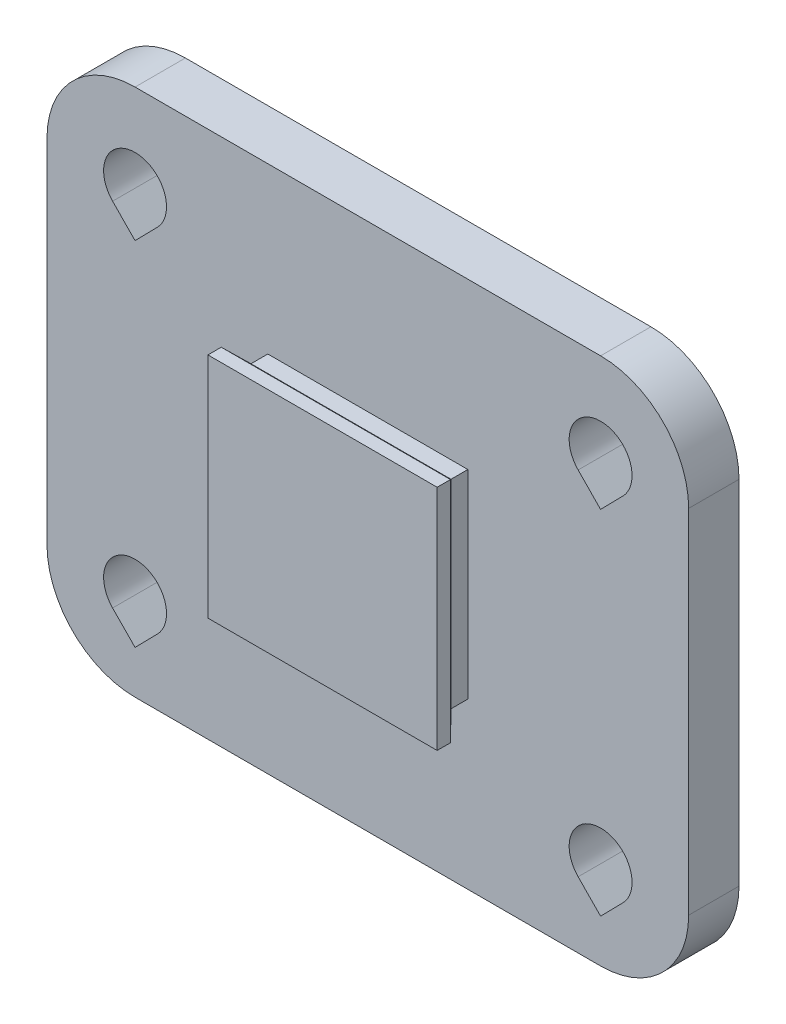
ISO-10303-21;
HEADER;
FILE_DESCRIPTION(('STEP AP214'),'2;1');
FILE_NAME('part.step','',(''),(''),'','','');
FILE_SCHEMA(('AUTOMOTIVE_DESIGN { 1 0 10303 214 1 1 1 1 }'));
ENDSEC;
DATA;
#1=APPLICATION_CONTEXT('core data for automotive mechanical design processes');
#2=APPLICATION_PROTOCOL_DEFINITION('international standard','automotive_design',2000,#1);
#3=PRODUCT_CONTEXT('',#1,'mechanical');
#4=PRODUCT('Part','Part','',(#3));
#5=PRODUCT_RELATED_PRODUCT_CATEGORY('part','',(#4));
#6=PRODUCT_DEFINITION_FORMATION('','',#4);
#7=PRODUCT_DEFINITION_CONTEXT('part definition',#1,'design');
#8=PRODUCT_DEFINITION('design','',#6,#7);
#9=PRODUCT_DEFINITION_SHAPE('','',#8);
#10=(LENGTH_UNIT() NAMED_UNIT(*) SI_UNIT(.MILLI.,.METRE.));
#11=(NAMED_UNIT(*) PLANE_ANGLE_UNIT() SI_UNIT($,.RADIAN.));
#12=(NAMED_UNIT(*) SI_UNIT($,.STERADIAN.) SOLID_ANGLE_UNIT());
#13=UNCERTAINTY_MEASURE_WITH_UNIT(LENGTH_MEASURE(1.E-05),#10,'distance_accuracy_value','');
#14=(GEOMETRIC_REPRESENTATION_CONTEXT(3) GLOBAL_UNCERTAINTY_ASSIGNED_CONTEXT((#13)) GLOBAL_UNIT_ASSIGNED_CONTEXT((#10,
#11,#12)) REPRESENTATION_CONTEXT('',''));
#15=CARTESIAN_POINT('',(0.,0.,0.));
#16=DIRECTION('',(0.,0.,1.));
#17=DIRECTION('',(1.,0.,0.));
#18=AXIS2_PLACEMENT_3D('',#15,#16,#17);
#19=CARTESIAN_POINT('',(18.5,10.426852951642,8.011074047634));
#20=DIRECTION('',(0.714472679633082,-0.699663340513081,0.));
#21=DIRECTION('',(0.,0.,-1.));
#22=AXIS2_PLACEMENT_3D('',#19,#20,#21);
#23=PLANE('',#22);
#24=DIRECTION('',(0.,0.,-1.));
#25=VECTOR('',#24,1.);
#26=CARTESIAN_POINT('',(18.5,10.426852951642,4.));
#27=LINE('',#26,#25);
#28=CARTESIAN_POINT('',(18.5,10.426852951642,4.));
#29=VERTEX_POINT('',#28);
#30=CARTESIAN_POINT('',(18.5,10.426852951642,0.));
#31=VERTEX_POINT('',#30);
#32=EDGE_CURVE('E11',#29,#31,#27,.T.);
#33=ORIENTED_EDGE('',*,*,#32,.F.);
#34=DIRECTION('',(0.699663340513081,0.714472679633082,0.));
#35=VECTOR('',#34,1.);
#36=CARTESIAN_POINT('',(18.5,10.426852951642,4.));
#37=LINE('',#36,#35);
#38=CARTESIAN_POINT('',(20.286181699082,12.250841648717,4.));
#39=VERTEX_POINT('',#38);
#40=EDGE_CURVE('E476',#29,#39,#37,.T.);
#41=ORIENTED_EDGE('',*,*,#40,.T.);
#42=DIRECTION('',(0.,0.,-1.));
#43=VECTOR('',#42,1.);
#44=CARTESIAN_POINT('',(20.286181699082,12.250841648717,4.));
#45=LINE('',#44,#43);
#46=CARTESIAN_POINT('',(20.286181699082,12.250841648717,0.));
#47=VERTEX_POINT('',#46);
#48=EDGE_CURVE('E341',#39,#47,#45,.T.);
#49=ORIENTED_EDGE('',*,*,#48,.T.);
#50=DIRECTION('',(0.699663340513081,0.714472679633082,0.));
#51=VECTOR('',#50,1.);
#52=CARTESIAN_POINT('',(18.5,10.426852951642,0.));
#53=LINE('',#52,#51);
#54=EDGE_CURVE('E312',#31,#47,#53,.T.);
#55=ORIENTED_EDGE('',*,*,#54,.F.);
#56=EDGE_LOOP('',(#33,#41,#49,#55));
#57=FACE_BOUND('',#56,.T.);
#58=ADVANCED_FACE('F17',(#57),#23,.F.);
#59=CARTESIAN_POINT('',(16.713818300918,12.250841648717,8.011074047634));
#60=DIRECTION('',(-0.714472679633082,-0.699663340513081,0.));
#61=DIRECTION('',(-0.699663340513081,0.714472679633082,0.));
#62=AXIS2_PLACEMENT_3D('',#59,#60,#61);
#63=PLANE('',#62);
#64=DIRECTION('',(0.,0.,-1.));
#65=VECTOR('',#64,1.);
#66=CARTESIAN_POINT('',(16.713818300918,12.250841648717,4.));
#67=LINE('',#66,#65);
#68=CARTESIAN_POINT('',(16.713818300918,12.250841648717,4.));
#69=VERTEX_POINT('',#68);
#70=CARTESIAN_POINT('',(16.713818300918,12.250841648717,0.));
#71=VERTEX_POINT('',#70);
#72=EDGE_CURVE('E338',#69,#71,#67,.T.);
#73=ORIENTED_EDGE('',*,*,#72,.F.);
#74=DIRECTION('',(0.699663340513081,-0.714472679633082,0.));
#75=VECTOR('',#74,1.);
#76=CARTESIAN_POINT('',(16.713818300918,12.250841648717,4.));
#77=LINE('',#76,#75);
#78=EDGE_CURVE('E484',#69,#29,#77,.T.);
#79=ORIENTED_EDGE('',*,*,#78,.T.);
#80=ORIENTED_EDGE('',*,*,#32,.T.);
#81=DIRECTION('',(0.699663340513081,-0.714472679633082,0.));
#82=VECTOR('',#81,1.);
#83=CARTESIAN_POINT('',(16.713818300918,12.250841648717,0.));
#84=LINE('',#83,#82);
#85=EDGE_CURVE('E333',#71,#31,#84,.T.);
#86=ORIENTED_EDGE('',*,*,#85,.F.);
#87=EDGE_LOOP('',(#73,#79,#80,#86));
#88=FACE_BOUND('',#87,.T.);
#89=ADVANCED_FACE('F457',(#88),#63,.F.);
#90=CARTESIAN_POINT('',(18.5,-17.57314704835,8.011074047634));
#91=DIRECTION('',(0.714472679633082,-0.699663340513081,0.));
#92=DIRECTION('',(0.,0.,-1.));
#93=AXIS2_PLACEMENT_3D('',#90,#91,#92);
#94=PLANE('',#93);
#95=DIRECTION('',(0.,0.,-1.));
#96=VECTOR('',#95,1.);
#97=CARTESIAN_POINT('',(18.5,-17.57314704835,4.));
#98=LINE('',#97,#96);
#99=CARTESIAN_POINT('',(18.5,-17.57314704835,4.));
#100=VERTEX_POINT('',#99);
#101=CARTESIAN_POINT('',(18.5,-17.57314704835,0.));
#102=VERTEX_POINT('',#101);
#103=EDGE_CURVE('E20',#100,#102,#98,.T.);
#104=ORIENTED_EDGE('',*,*,#103,.F.);
#105=DIRECTION('',(0.699663340513081,0.714472679633082,0.));
#106=VECTOR('',#105,1.);
#107=CARTESIAN_POINT('',(18.5,-17.57314704835,4.));
#108=LINE('',#107,#106);
#109=CARTESIAN_POINT('',(20.286181699082,-15.74915835128,4.));
#110=VERTEX_POINT('',#109);
#111=EDGE_CURVE('E491',#100,#110,#108,.T.);
#112=ORIENTED_EDGE('',*,*,#111,.T.);
#113=DIRECTION('',(0.,0.,-1.));
#114=VECTOR('',#113,1.);
#115=CARTESIAN_POINT('',(20.286181699082,-15.74915835128,4.));
#116=LINE('',#115,#114);
#117=CARTESIAN_POINT('',(20.286181699082,-15.74915835128,0.));
#118=VERTEX_POINT('',#117);
#119=EDGE_CURVE('E400',#110,#118,#116,.T.);
#120=ORIENTED_EDGE('',*,*,#119,.T.);
#121=DIRECTION('',(0.699663340513081,0.714472679633082,0.));
#122=VECTOR('',#121,1.);
#123=CARTESIAN_POINT('',(18.5,-17.57314704835,0.));
#124=LINE('',#123,#122);
#125=EDGE_CURVE('E337',#102,#118,#124,.T.);
#126=ORIENTED_EDGE('',*,*,#125,.F.);
#127=EDGE_LOOP('',(#104,#112,#120,#126));
#128=FACE_BOUND('',#127,.T.);
#129=ADVANCED_FACE('F455',(#128),#94,.F.);
#130=CARTESIAN_POINT('',(16.713818300918,-15.74915835128,8.011074047634));
#131=DIRECTION('',(-0.714472679633082,-0.699663340513081,0.));
#132=DIRECTION('',(-0.699663340513081,0.714472679633082,0.));
#133=AXIS2_PLACEMENT_3D('',#130,#131,#132);
#134=PLANE('',#133);
#135=DIRECTION('',(0.,0.,-1.));
#136=VECTOR('',#135,1.);
#137=CARTESIAN_POINT('',(16.713818300918,-15.74915835128,4.));
#138=LINE('',#137,#136);
#139=CARTESIAN_POINT('',(16.713818300918,-15.74915835128,4.));
#140=VERTEX_POINT('',#139);
#141=CARTESIAN_POINT('',(16.713818300918,-15.74915835128,0.));
#142=VERTEX_POINT('',#141);
#143=EDGE_CURVE('E397',#140,#142,#138,.T.);
#144=ORIENTED_EDGE('',*,*,#143,.F.);
#145=DIRECTION('',(0.699663340513081,-0.714472679633082,0.));
#146=VECTOR('',#145,1.);
#147=CARTESIAN_POINT('',(16.713818300918,-15.74915835128,4.));
#148=LINE('',#147,#146);
#149=EDGE_CURVE('E451',#140,#100,#148,.T.);
#150=ORIENTED_EDGE('',*,*,#149,.T.);
#151=ORIENTED_EDGE('',*,*,#103,.T.);
#152=DIRECTION('',(0.699663340513081,-0.714472679633082,0.));
#153=VECTOR('',#152,1.);
#154=CARTESIAN_POINT('',(16.713818300918,-15.74915835128,0.));
#155=LINE('',#154,#153);
#156=EDGE_CURVE('E353',#142,#102,#155,.T.);
#157=ORIENTED_EDGE('',*,*,#156,.F.);
#158=EDGE_LOOP('',(#144,#150,#151,#157));
#159=FACE_BOUND('',#158,.T.);
#160=ADVANCED_FACE('F449',(#159),#134,.F.);
#161=CARTESIAN_POINT('',(18.5,-14.,4.));
#162=DIRECTION('',(0.,0.,-1.));
#163=DIRECTION('',(0.,1.,0.));
#164=AXIS2_PLACEMENT_3D('',#161,#162,#163);
#165=CYLINDRICAL_SURFACE('',#164,2.5);
#166=ORIENTED_EDGE('',*,*,#143,.T.);
#167=CARTESIAN_POINT('',(18.5,-14.,0.));
#168=DIRECTION('',(0.,0.,1.));
#169=DIRECTION('',(-1.,0.,0.));
#170=AXIS2_PLACEMENT_3D('',#167,#168,#169);
#171=CIRCLE('',#170,2.5);
#172=EDGE_CURVE('E349',#118,#142,#171,.T.);
#173=ORIENTED_EDGE('',*,*,#172,.F.);
#174=ORIENTED_EDGE('',*,*,#119,.F.);
#175=CARTESIAN_POINT('',(18.5,-14.,4.));
#176=DIRECTION('',(0.,0.,1.));
#177=DIRECTION('',(-1.,0.,0.));
#178=AXIS2_PLACEMENT_3D('',#175,#176,#177);
#179=CIRCLE('',#178,2.5);
#180=EDGE_CURVE('E498',#110,#140,#179,.T.);
#181=ORIENTED_EDGE('',*,*,#180,.T.);
#182=EDGE_LOOP('',(#166,#173,#174,#181));
#183=FACE_BOUND('',#182,.T.);
#184=ADVANCED_FACE('F465',(#183),#165,.F.);
#185=CARTESIAN_POINT('',(18.5,-14.,4.));
#186=DIRECTION('',(0.,0.,-1.));
#187=DIRECTION('',(1.,0.,0.));
#188=AXIS2_PLACEMENT_3D('',#185,#186,#187);
#189=CYLINDRICAL_SURFACE('',#188,7.);
#190=CARTESIAN_POINT('',(18.5,-14.,0.));
#191=DIRECTION('',(0.,0.,1.));
#192=DIRECTION('',(-1.,0.,0.));
#193=AXIS2_PLACEMENT_3D('',#190,#191,#192);
#194=CIRCLE('',#193,7.);
#195=CARTESIAN_POINT('',(18.5,-21.,0.));
#196=VERTEX_POINT('',#195);
#197=CARTESIAN_POINT('',(25.5,-14.,0.));
#198=VERTEX_POINT('',#197);
#199=EDGE_CURVE('E520',#196,#198,#194,.T.);
#200=ORIENTED_EDGE('',*,*,#199,.T.);
#201=DIRECTION('',(0.,0.,-1.));
#202=VECTOR('',#201,1.);
#203=CARTESIAN_POINT('',(25.5,-14.,4.));
#204=LINE('',#203,#202);
#205=CARTESIAN_POINT('',(25.5,-14.,4.));
#206=VERTEX_POINT('',#205);
#207=EDGE_CURVE('E316',#206,#198,#204,.T.);
#208=ORIENTED_EDGE('',*,*,#207,.F.);
#209=CARTESIAN_POINT('',(18.5,-14.,4.));
#210=DIRECTION('',(0.,0.,1.));
#211=DIRECTION('',(-1.,0.,0.));
#212=AXIS2_PLACEMENT_3D('',#209,#210,#211);
#213=CIRCLE('',#212,7.);
#214=CARTESIAN_POINT('',(18.5,-21.,4.));
#215=VERTEX_POINT('',#214);
#216=EDGE_CURVE('E697',#215,#206,#213,.T.);
#217=ORIENTED_EDGE('',*,*,#216,.F.);
#218=DIRECTION('',(0.,0.,-1.));
#219=VECTOR('',#218,1.);
#220=CARTESIAN_POINT('',(18.5,-21.,4.));
#221=LINE('',#220,#219);
#222=EDGE_CURVE('E367',#215,#196,#221,.T.);
#223=ORIENTED_EDGE('',*,*,#222,.T.);
#224=EDGE_LOOP('',(#200,#208,#217,#223));
#225=FACE_BOUND('',#224,.T.);
#226=ADVANCED_FACE('F565',(#225),#189,.T.);
#227=CARTESIAN_POINT('',(7.95,9.274709182745,5.340402622584));
#228=DIRECTION('',(-0.719339800338818,0.,0.694658370458825));
#229=DIRECTION('',(0.,1.,0.));
#230=AXIS2_PLACEMENT_3D('',#227,#228,#229);
#231=PLANE('',#230);
#232=DIRECTION('',(-0.570514335805256,-0.570514335805256,-0.590784889178265));
#233=VECTOR('',#232,1.);
#234=CARTESIAN_POINT('',(9.108826529768,9.058826529768,6.540402622584));
#235=LINE('',#234,#233);
#236=CARTESIAN_POINT('',(9.108826529768,9.058826529769,6.540402622584));
#237=VERTEX_POINT('',#236);
#238=CARTESIAN_POINT('',(7.95,7.9,5.340402622584));
#239=VERTEX_POINT('',#238);
#240=EDGE_CURVE('E379',#237,#239,#235,.T.);
#241=ORIENTED_EDGE('',*,*,#240,.F.);
#242=DIRECTION('',(0.,-1.,0.));
#243=VECTOR('',#242,1.);
#244=CARTESIAN_POINT('',(9.108826529768,9.058826529768,6.540402622584));
#245=LINE('',#244,#243);
#246=CARTESIAN_POINT('',(9.108826529768,-9.058826529768,6.540402622584));
#247=VERTEX_POINT('',#246);
#248=EDGE_CURVE('E38',#237,#247,#245,.T.);
#249=ORIENTED_EDGE('',*,*,#248,.T.);
#250=DIRECTION('',(-0.570514335805256,0.570514335805256,-0.590784889178265));
#251=VECTOR('',#250,1.);
#252=CARTESIAN_POINT('',(9.108826529768,-9.058826529768,6.540402622584));
#253=LINE('',#252,#251);
#254=CARTESIAN_POINT('',(7.95,-7.9,5.340402622584));
#255=VERTEX_POINT('',#254);
#256=EDGE_CURVE('E427',#247,#255,#253,.T.);
#257=ORIENTED_EDGE('',*,*,#256,.T.);
#258=DIRECTION('',(0.,-1.,0.));
#259=VECTOR('',#258,1.);
#260=CARTESIAN_POINT('',(7.95,7.9,5.340402622584));
#261=LINE('',#260,#259);
#262=EDGE_CURVE('E51',#239,#255,#261,.T.);
#263=ORIENTED_EDGE('',*,*,#262,.F.);
#264=EDGE_LOOP('',(#241,#249,#257,#263));
#265=FACE_BOUND('',#264,.T.);
#266=ADVANCED_FACE('F568',(#265),#231,.F.);
#267=CARTESIAN_POINT('',(9.108826529768,9.274709182745,6.540402622584));
#268=DIRECTION('',(-1.,0.,0.));
#269=DIRECTION('',(0.,0.,1.));
#270=AXIS2_PLACEMENT_3D('',#267,#268,#269);
#271=PLANE('',#270);
#272=DIRECTION('',(0.,0.,-1.));
#273=VECTOR('',#272,1.);
#274=CARTESIAN_POINT('',(9.108826529768,9.058826529768,7.6));
#275=LINE('',#274,#273);
#276=CARTESIAN_POINT('',(9.108826529768,9.058826529769,7.6));
#277=VERTEX_POINT('',#276);
#278=EDGE_CURVE('E321',#277,#237,#275,.T.);
#279=ORIENTED_EDGE('',*,*,#278,.F.);
#280=DIRECTION('',(0.,-1.,0.));
#281=VECTOR('',#280,1.);
#282=CARTESIAN_POINT('',(9.108826529768,9.058826529768,7.6));
#283=LINE('',#282,#281);
#284=CARTESIAN_POINT('',(9.108826529768,-9.058826529768,7.6));
#285=VERTEX_POINT('',#284);
#286=EDGE_CURVE('E131',#277,#285,#283,.T.);
#287=ORIENTED_EDGE('',*,*,#286,.T.);
#288=DIRECTION('',(0.,0.,-1.));
#289=VECTOR('',#288,1.);
#290=CARTESIAN_POINT('',(9.108826529768,-9.058826529768,7.6));
#291=LINE('',#290,#289);
#292=EDGE_CURVE('E415',#285,#247,#291,.T.);
#293=ORIENTED_EDGE('',*,*,#292,.T.);
#294=ORIENTED_EDGE('',*,*,#248,.F.);
#295=EDGE_LOOP('',(#279,#287,#293,#294));
#296=FACE_BOUND('',#295,.T.);
#297=ADVANCED_FACE('F638',(#296),#271,.F.);
#298=CARTESIAN_POINT('',(7.95,9.274709182745,4.));
#299=DIRECTION('',(-1.,0.,0.));
#300=DIRECTION('',(0.,0.,1.));
#301=AXIS2_PLACEMENT_3D('',#298,#299,#300);
#302=PLANE('',#301);
#303=DIRECTION('',(0.,0.,-1.));
#304=VECTOR('',#303,1.);
#305=CARTESIAN_POINT('',(7.95,7.9,5.340402622584));
#306=LINE('',#305,#304);
#307=CARTESIAN_POINT('',(7.95,7.9,4.));
#308=VERTEX_POINT('',#307);
#309=EDGE_CURVE('E342',#239,#308,#306,.T.);
#310=ORIENTED_EDGE('',*,*,#309,.F.);
#311=ORIENTED_EDGE('',*,*,#262,.T.);
#312=DIRECTION('',(0.,0.,-1.));
#313=VECTOR('',#312,1.);
#314=CARTESIAN_POINT('',(7.95,-7.9,5.340402622584));
#315=LINE('',#314,#313);
#316=CARTESIAN_POINT('',(7.95,-7.9,4.));
#317=VERTEX_POINT('',#316);
#318=EDGE_CURVE('E416',#255,#317,#315,.T.);
#319=ORIENTED_EDGE('',*,*,#318,.T.);
#320=DIRECTION('',(0.,-1.,0.));
#321=VECTOR('',#320,1.);
#322=CARTESIAN_POINT('',(7.95,7.9,4.));
#323=LINE('',#322,#321);
#324=EDGE_CURVE('E658',#308,#317,#323,.T.);
#325=ORIENTED_EDGE('',*,*,#324,.F.);
#326=EDGE_LOOP('',(#310,#311,#319,#325));
#327=FACE_BOUND('',#326,.T.);
#328=ADVANCED_FACE('F634',(#327),#302,.F.);
#329=CARTESIAN_POINT('',(18.5,14.,4.));
#330=DIRECTION('',(0.,0.,-1.));
#331=DIRECTION('',(0.,1.,0.));
#332=AXIS2_PLACEMENT_3D('',#329,#330,#331);
#333=CYLINDRICAL_SURFACE('',#332,2.5);
#334=ORIENTED_EDGE('',*,*,#72,.T.);
#335=CARTESIAN_POINT('',(18.5,14.,0.));
#336=DIRECTION('',(0.,0.,-1.));
#337=DIRECTION('',(-1.,0.,0.));
#338=AXIS2_PLACEMENT_3D('',#335,#336,#337);
#339=CIRCLE('',#338,2.5);
#340=EDGE_CURVE('E329',#71,#47,#339,.T.);
#341=ORIENTED_EDGE('',*,*,#340,.T.);
#342=ORIENTED_EDGE('',*,*,#48,.F.);
#343=CARTESIAN_POINT('',(18.5,14.,4.));
#344=DIRECTION('',(0.,0.,-1.));
#345=DIRECTION('',(-1.,0.,0.));
#346=AXIS2_PLACEMENT_3D('',#343,#344,#345);
#347=CIRCLE('',#346,2.5);
#348=EDGE_CURVE('E486',#69,#39,#347,.T.);
#349=ORIENTED_EDGE('',*,*,#348,.F.);
#350=EDGE_LOOP('',(#334,#341,#342,#349));
#351=FACE_BOUND('',#350,.T.);
#352=ADVANCED_FACE('F630',(#351),#333,.F.);
#353=CARTESIAN_POINT('',(25.5,0.,4.));
#354=DIRECTION('',(-1.,0.,0.));
#355=DIRECTION('',(0.,0.,1.));
#356=AXIS2_PLACEMENT_3D('',#353,#354,#355);
#357=PLANE('',#356);
#358=DIRECTION('',(0.,-1.,0.));
#359=VECTOR('',#358,1.);
#360=CARTESIAN_POINT('',(25.5,14.,0.));
#361=LINE('',#360,#359);
#362=CARTESIAN_POINT('',(25.5,14.,0.));
#363=VERTEX_POINT('',#362);
#364=EDGE_CURVE('E514',#363,#198,#361,.T.);
#365=ORIENTED_EDGE('',*,*,#364,.F.);
#366=DIRECTION('',(0.,0.,-1.));
#367=VECTOR('',#366,1.);
#368=CARTESIAN_POINT('',(25.5,14.,4.));
#369=LINE('',#368,#367);
#370=CARTESIAN_POINT('',(25.5,14.,4.));
#371=VERTEX_POINT('',#370);
#372=EDGE_CURVE('E313',#371,#363,#369,.T.);
#373=ORIENTED_EDGE('',*,*,#372,.F.);
#374=DIRECTION('',(0.,-1.,0.));
#375=VECTOR('',#374,1.);
#376=CARTESIAN_POINT('',(25.5,14.,4.));
#377=LINE('',#376,#375);
#378=EDGE_CURVE('E696',#371,#206,#377,.T.);
#379=ORIENTED_EDGE('',*,*,#378,.T.);
#380=ORIENTED_EDGE('',*,*,#207,.T.);
#381=EDGE_LOOP('',(#365,#373,#379,#380));
#382=FACE_BOUND('',#381,.T.);
#383=ADVANCED_FACE('F626',(#382),#357,.F.);
#384=CARTESIAN_POINT('',(18.5,14.,4.));
#385=DIRECTION('',(0.,0.,-1.));
#386=DIRECTION('',(1.,0.,0.));
#387=AXIS2_PLACEMENT_3D('',#384,#385,#386);
#388=CYLINDRICAL_SURFACE('',#387,7.);
#389=CARTESIAN_POINT('',(18.5,14.,0.));
#390=DIRECTION('',(0.,0.,-1.));
#391=DIRECTION('',(-1.,0.,0.));
#392=AXIS2_PLACEMENT_3D('',#389,#390,#391);
#393=CIRCLE('',#392,7.);
#394=CARTESIAN_POINT('',(18.5,21.,0.));
#395=VERTEX_POINT('',#394);
#396=EDGE_CURVE('E510',#395,#363,#393,.T.);
#397=ORIENTED_EDGE('',*,*,#396,.F.);
#398=DIRECTION('',(0.,0.,-1.));
#399=VECTOR('',#398,1.);
#400=CARTESIAN_POINT('',(18.5,21.,4.));
#401=LINE('',#400,#399);
#402=CARTESIAN_POINT('',(18.5,21.,4.));
#403=VERTEX_POINT('',#402);
#404=EDGE_CURVE('E266',#403,#395,#401,.T.);
#405=ORIENTED_EDGE('',*,*,#404,.F.);
#406=CARTESIAN_POINT('',(18.5,14.,4.));
#407=DIRECTION('',(0.,0.,-1.));
#408=DIRECTION('',(-1.,0.,0.));
#409=AXIS2_PLACEMENT_3D('',#406,#407,#408);
#410=CIRCLE('',#409,7.);
#411=EDGE_CURVE('E723',#403,#371,#410,.T.);
#412=ORIENTED_EDGE('',*,*,#411,.T.);
#413=ORIENTED_EDGE('',*,*,#372,.T.);
#414=EDGE_LOOP('',(#397,#405,#412,#413));
#415=FACE_BOUND('',#414,.T.);
#416=ADVANCED_FACE('F597',(#415),#388,.T.);
#417=CARTESIAN_POINT('',(-18.5,10.426852951642,8.011074047634));
#418=DIRECTION('',(-0.714472679633082,-0.699663340513081,0.));
#419=DIRECTION('',(-0.699663340513081,0.714472679633082,0.));
#420=AXIS2_PLACEMENT_3D('',#417,#418,#419);
#421=PLANE('',#420);
#422=DIRECTION('',(0.,0.,-1.));
#423=VECTOR('',#422,1.);
#424=CARTESIAN_POINT('',(-18.5,10.426852951642,4.));
#425=LINE('',#424,#423);
#426=CARTESIAN_POINT('',(-18.5,10.426852951642,4.));
#427=VERTEX_POINT('',#426);
#428=CARTESIAN_POINT('',(-18.5,10.426852951642,0.));
#429=VERTEX_POINT('',#428);
#430=EDGE_CURVE('E317',#427,#429,#425,.T.);
#431=ORIENTED_EDGE('',*,*,#430,.T.);
#432=DIRECTION('',(-0.699663340513081,0.714472679633082,0.));
#433=VECTOR('',#432,1.);
#434=CARTESIAN_POINT('',(-18.5,10.426852951642,0.));
#435=LINE('',#434,#433);
#436=CARTESIAN_POINT('',(-20.28618169908,12.250841648717,0.));
#437=VERTEX_POINT('',#436);
#438=EDGE_CURVE('E277',#429,#437,#435,.T.);
#439=ORIENTED_EDGE('',*,*,#438,.T.);
#440=DIRECTION('',(0.,0.,-1.));
#441=VECTOR('',#440,1.);
#442=CARTESIAN_POINT('',(-20.28618169908,12.250841648717,4.));
#443=LINE('',#442,#441);
#444=CARTESIAN_POINT('',(-20.28618169908,12.250841648717,4.));
#445=VERTEX_POINT('',#444);
#446=EDGE_CURVE('E373',#445,#437,#443,.T.);
#447=ORIENTED_EDGE('',*,*,#446,.F.);
#448=DIRECTION('',(-0.699663340513081,0.714472679633082,0.));
#449=VECTOR('',#448,1.);
#450=CARTESIAN_POINT('',(-18.5,10.426852951642,4.));
#451=LINE('',#450,#449);
#452=EDGE_CURVE('E672',#427,#445,#451,.T.);
#453=ORIENTED_EDGE('',*,*,#452,.F.);
#454=EDGE_LOOP('',(#431,#439,#447,#453));
#455=FACE_BOUND('',#454,.T.);
#456=ADVANCED_FACE('F593',(#455),#421,.F.);
#457=CARTESIAN_POINT('',(-16.71381830091,12.250841648717,8.011074047634));
#458=DIRECTION('',(0.714472679633082,-0.699663340513081,0.));
#459=DIRECTION('',(0.,0.,-1.));
#460=AXIS2_PLACEMENT_3D('',#457,#458,#459);
#461=PLANE('',#460);
#462=DIRECTION('',(0.,0.,-1.));
#463=VECTOR('',#462,1.);
#464=CARTESIAN_POINT('',(-16.71381830091,12.250841648717,4.));
#465=LINE('',#464,#463);
#466=CARTESIAN_POINT('',(-16.71381830091,12.250841648717,4.));
#467=VERTEX_POINT('',#466);
#468=CARTESIAN_POINT('',(-16.71381830091,12.250841648717,0.));
#469=VERTEX_POINT('',#468);
#470=EDGE_CURVE('E325',#467,#469,#465,.T.);
#471=ORIENTED_EDGE('',*,*,#470,.T.);
#472=DIRECTION('',(-0.699663340513081,-0.714472679633082,0.));
#473=VECTOR('',#472,1.);
#474=CARTESIAN_POINT('',(-16.71381830091,12.250841648717,0.));
#475=LINE('',#474,#473);
#476=EDGE_CURVE('E295',#469,#429,#475,.T.);
#477=ORIENTED_EDGE('',*,*,#476,.T.);
#478=ORIENTED_EDGE('',*,*,#430,.F.);
#479=DIRECTION('',(-0.699663340513081,-0.714472679633082,0.));
#480=VECTOR('',#479,1.);
#481=CARTESIAN_POINT('',(-16.71381830091,12.250841648717,4.));
#482=LINE('',#481,#480);
#483=EDGE_CURVE('E683',#467,#427,#482,.T.);
#484=ORIENTED_EDGE('',*,*,#483,.F.);
#485=EDGE_LOOP('',(#471,#477,#478,#484));
#486=FACE_BOUND('',#485,.T.);
#487=ADVANCED_FACE('F596',(#486),#461,.F.);
#488=CARTESIAN_POINT('',(-18.5,-17.57314704835,8.011074047634));
#489=DIRECTION('',(-0.714472679633082,-0.699663340513081,0.));
#490=DIRECTION('',(-0.699663340513081,0.714472679633082,0.));
#491=AXIS2_PLACEMENT_3D('',#488,#489,#490);
#492=PLANE('',#491);
#493=DIRECTION('',(0.,0.,-1.));
#494=VECTOR('',#493,1.);
#495=CARTESIAN_POINT('',(-18.5,-17.57314704835,4.));
#496=LINE('',#495,#494);
#497=CARTESIAN_POINT('',(-18.5,-17.57314704835,4.));
#498=VERTEX_POINT('',#497);
#499=CARTESIAN_POINT('',(-18.5,-17.57314704835,0.));
#500=VERTEX_POINT('',#499);
#501=EDGE_CURVE('E290',#498,#500,#496,.T.);
#502=ORIENTED_EDGE('',*,*,#501,.T.);
#503=DIRECTION('',(-0.699663340513081,0.714472679633082,0.));
#504=VECTOR('',#503,1.);
#505=CARTESIAN_POINT('',(-18.5,-17.57314704835,0.));
#506=LINE('',#505,#504);
#507=CARTESIAN_POINT('',(-20.28618169908,-15.74915835128,0.));
#508=VERTEX_POINT('',#507);
#509=EDGE_CURVE('E300',#500,#508,#506,.T.);
#510=ORIENTED_EDGE('',*,*,#509,.T.);
#511=DIRECTION('',(0.,0.,-1.));
#512=VECTOR('',#511,1.);
#513=CARTESIAN_POINT('',(-20.28618169908,-15.74915835128,4.));
#514=LINE('',#513,#512);
#515=CARTESIAN_POINT('',(-20.28618169908,-15.74915835128,4.));
#516=VERTEX_POINT('',#515);
#517=EDGE_CURVE('E422',#516,#508,#514,.T.);
#518=ORIENTED_EDGE('',*,*,#517,.F.);
#519=DIRECTION('',(-0.699663340513081,0.714472679633082,0.));
#520=VECTOR('',#519,1.);
#521=CARTESIAN_POINT('',(-18.5,-17.57314704835,4.));
#522=LINE('',#521,#520);
#523=EDGE_CURVE('E684',#498,#516,#522,.T.);
#524=ORIENTED_EDGE('',*,*,#523,.F.);
#525=EDGE_LOOP('',(#502,#510,#518,#524));
#526=FACE_BOUND('',#525,.T.);
#527=ADVANCED_FACE('F616',(#526),#492,.F.);
#528=CARTESIAN_POINT('',(-16.71381830091,-15.74915835128,8.011074047634));
#529=DIRECTION('',(0.714472679633082,-0.699663340513081,0.));
#530=DIRECTION('',(0.,0.,-1.));
#531=AXIS2_PLACEMENT_3D('',#528,#529,#530);
#532=PLANE('',#531);
#533=DIRECTION('',(0.,0.,-1.));
#534=VECTOR('',#533,1.);
#535=CARTESIAN_POINT('',(-16.71381830091,-15.74915835128,4.));
#536=LINE('',#535,#534);
#537=CARTESIAN_POINT('',(-16.71381830091,-15.74915835128,4.));
#538=VERTEX_POINT('',#537);
#539=CARTESIAN_POINT('',(-16.71381830091,-15.74915835128,0.));
#540=VERTEX_POINT('',#539);
#541=EDGE_CURVE('E366',#538,#540,#536,.T.);
#542=ORIENTED_EDGE('',*,*,#541,.T.);
#543=DIRECTION('',(-0.699663340513081,-0.714472679633082,0.));
#544=VECTOR('',#543,1.);
#545=CARTESIAN_POINT('',(-16.71381830091,-15.74915835128,0.));
#546=LINE('',#545,#544);
#547=EDGE_CURVE('E304',#540,#500,#546,.T.);
#548=ORIENTED_EDGE('',*,*,#547,.T.);
#549=ORIENTED_EDGE('',*,*,#501,.F.);
#550=DIRECTION('',(-0.699663340513081,-0.714472679633082,0.));
#551=VECTOR('',#550,1.);
#552=CARTESIAN_POINT('',(-16.71381830091,-15.74915835128,4.));
#553=LINE('',#552,#551);
#554=EDGE_CURVE('E692',#538,#498,#553,.T.);
#555=ORIENTED_EDGE('',*,*,#554,.F.);
#556=EDGE_LOOP('',(#542,#548,#549,#555));
#557=FACE_BOUND('',#556,.T.);
#558=ADVANCED_FACE('F612',(#557),#532,.F.);
#559=CARTESIAN_POINT('',(0.,-7.9,5.340402622584));
#560=DIRECTION('',(0.,0.719339800338818,0.694658370458825));
#561=DIRECTION('',(1.,0.,0.));
#562=AXIS2_PLACEMENT_3D('',#559,#560,#561);
#563=PLANE('',#562);
#564=DIRECTION('',(-1.,0.,0.));
#565=VECTOR('',#564,1.);
#566=CARTESIAN_POINT('',(9.108826529768,-9.058826529768,6.540402622584));
#567=LINE('',#566,#565);
#568=CARTESIAN_POINT('',(-9.108826529768,-9.058826529768,6.540402622584));
#569=VERTEX_POINT('',#568);
#570=EDGE_CURVE('E412',#247,#569,#567,.T.);
#571=ORIENTED_EDGE('',*,*,#570,.T.);
#572=DIRECTION('',(0.570514335805256,0.570514335805256,-0.590784889178265));
#573=VECTOR('',#572,1.);
#574=CARTESIAN_POINT('',(-9.108826529768,-9.058826529768,6.540402622584));
#575=LINE('',#574,#573);
#576=CARTESIAN_POINT('',(-7.95,-7.9,5.340402622584));
#577=VERTEX_POINT('',#576);
#578=EDGE_CURVE('E368',#569,#577,#575,.T.);
#579=ORIENTED_EDGE('',*,*,#578,.T.);
#580=DIRECTION('',(-1.,0.,0.));
#581=VECTOR('',#580,1.);
#582=CARTESIAN_POINT('',(7.95,-7.9,5.340402622584));
#583=LINE('',#582,#581);
#584=EDGE_CURVE('E419',#255,#577,#583,.T.);
#585=ORIENTED_EDGE('',*,*,#584,.F.);
#586=ORIENTED_EDGE('',*,*,#256,.F.);
#587=EDGE_LOOP('',(#571,#579,#585,#586));
#588=FACE_BOUND('',#587,.T.);
#589=ADVANCED_FACE('F608',(#588),#563,.F.);
#590=CARTESIAN_POINT('',(0.,-9.058826529768,6.540402622584));
#591=DIRECTION('',(0.,1.,0.));
#592=DIRECTION('',(1.,0.,0.));
#593=AXIS2_PLACEMENT_3D('',#590,#591,#592);
#594=PLANE('',#593);
#595=DIRECTION('',(-1.,0.,0.));
#596=VECTOR('',#595,1.);
#597=CARTESIAN_POINT('',(9.108826529768,-9.058826529768,7.6));
#598=LINE('',#597,#596);
#599=CARTESIAN_POINT('',(-9.108826529768,-9.058826529768,7.6));
#600=VERTEX_POINT('',#599);
#601=EDGE_CURVE('E322',#285,#600,#598,.T.);
#602=ORIENTED_EDGE('',*,*,#601,.T.);
#603=DIRECTION('',(0.,0.,-1.));
#604=VECTOR('',#603,1.);
#605=CARTESIAN_POINT('',(-9.108826529768,-9.058826529768,7.6));
#606=LINE('',#605,#604);
#607=EDGE_CURVE('E393',#600,#569,#606,.T.);
#608=ORIENTED_EDGE('',*,*,#607,.T.);
#609=ORIENTED_EDGE('',*,*,#570,.F.);
#610=ORIENTED_EDGE('',*,*,#292,.F.);
#611=EDGE_LOOP('',(#602,#608,#609,#610));
#612=FACE_BOUND('',#611,.T.);
#613=ADVANCED_FACE('F605',(#612),#594,.F.);
#614=CARTESIAN_POINT('',(0.,-7.9,4.));
#615=DIRECTION('',(0.,1.,0.));
#616=DIRECTION('',(1.,0.,0.));
#617=AXIS2_PLACEMENT_3D('',#614,#615,#616);
#618=PLANE('',#617);
#619=ORIENTED_EDGE('',*,*,#584,.T.);
#620=DIRECTION('',(0.,0.,-1.));
#621=VECTOR('',#620,1.);
#622=CARTESIAN_POINT('',(-7.95,-7.9,5.340402622584));
#623=LINE('',#622,#621);
#624=CARTESIAN_POINT('',(-7.95,-7.9,4.));
#625=VERTEX_POINT('',#624);
#626=EDGE_CURVE('E505',#577,#625,#623,.T.);
#627=ORIENTED_EDGE('',*,*,#626,.T.);
#628=DIRECTION('',(-1.,0.,0.));
#629=VECTOR('',#628,1.);
#630=CARTESIAN_POINT('',(7.95,-7.9,4.));
#631=LINE('',#630,#629);
#632=EDGE_CURVE('E652',#317,#625,#631,.T.);
#633=ORIENTED_EDGE('',*,*,#632,.F.);
#634=ORIENTED_EDGE('',*,*,#318,.F.);
#635=EDGE_LOOP('',(#619,#627,#633,#634));
#636=FACE_BOUND('',#635,.T.);
#637=ADVANCED_FACE('F548',(#636),#618,.F.);
#638=CARTESIAN_POINT('',(-18.5,-14.,4.));
#639=DIRECTION('',(0.,0.,-1.));
#640=DIRECTION('',(0.,1.,0.));
#641=AXIS2_PLACEMENT_3D('',#638,#639,#640);
#642=CYLINDRICAL_SURFACE('',#641,2.5);
#643=ORIENTED_EDGE('',*,*,#541,.F.);
#644=CARTESIAN_POINT('',(-18.5,-14.,4.));
#645=DIRECTION('',(0.,0.,-1.));
#646=DIRECTION('',(1.,0.,0.));
#647=AXIS2_PLACEMENT_3D('',#644,#645,#646);
#648=CIRCLE('',#647,2.5);
#649=EDGE_CURVE('E679',#516,#538,#648,.T.);
#650=ORIENTED_EDGE('',*,*,#649,.F.);
#651=ORIENTED_EDGE('',*,*,#517,.T.);
#652=CARTESIAN_POINT('',(-18.5,-14.,0.));
#653=DIRECTION('',(0.,0.,-1.));
#654=DIRECTION('',(1.,0.,0.));
#655=AXIS2_PLACEMENT_3D('',#652,#653,#654);
#656=CIRCLE('',#655,2.5);
#657=EDGE_CURVE('E308',#508,#540,#656,.T.);
#658=ORIENTED_EDGE('',*,*,#657,.T.);
#659=EDGE_LOOP('',(#643,#650,#651,#658));
#660=FACE_BOUND('',#659,.T.);
#661=ADVANCED_FACE('F539',(#660),#642,.F.);
#662=CARTESIAN_POINT('',(-18.5,-14.,4.));
#663=DIRECTION('',(0.,0.,-1.));
#664=DIRECTION('',(-1.,0.,0.));
#665=AXIS2_PLACEMENT_3D('',#662,#663,#664);
#666=CYLINDRICAL_SURFACE('',#665,7.);
#667=CARTESIAN_POINT('',(-18.5,-14.,0.));
#668=DIRECTION('',(0.,0.,-1.));
#669=DIRECTION('',(1.,0.,0.));
#670=AXIS2_PLACEMENT_3D('',#667,#668,#669);
#671=CIRCLE('',#670,7.);
#672=CARTESIAN_POINT('',(-18.5,-21.,0.));
#673=VERTEX_POINT('',#672);
#674=CARTESIAN_POINT('',(-25.5,-14.,0.));
#675=VERTEX_POINT('',#674);
#676=EDGE_CURVE('E281',#673,#675,#671,.T.);
#677=ORIENTED_EDGE('',*,*,#676,.F.);
#678=DIRECTION('',(0.,0.,-1.));
#679=VECTOR('',#678,1.);
#680=CARTESIAN_POINT('',(-18.5,-21.,4.));
#681=LINE('',#680,#679);
#682=CARTESIAN_POINT('',(-18.5,-21.,4.));
#683=VERTEX_POINT('',#682);
#684=EDGE_CURVE('E363',#683,#673,#681,.T.);
#685=ORIENTED_EDGE('',*,*,#684,.F.);
#686=CARTESIAN_POINT('',(-18.5,-14.,4.));
#687=DIRECTION('',(0.,0.,-1.));
#688=DIRECTION('',(1.,0.,0.));
#689=AXIS2_PLACEMENT_3D('',#686,#687,#688);
#690=CIRCLE('',#689,7.);
#691=CARTESIAN_POINT('',(-25.5,-14.,4.));
#692=VERTEX_POINT('',#691);
#693=EDGE_CURVE('E703',#683,#692,#690,.T.);
#694=ORIENTED_EDGE('',*,*,#693,.T.);
#695=DIRECTION('',(0.,0.,-1.));
#696=VECTOR('',#695,1.);
#697=CARTESIAN_POINT('',(-25.5,-14.,4.));
#698=LINE('',#697,#696);
#699=EDGE_CURVE('E246',#692,#675,#698,.T.);
#700=ORIENTED_EDGE('',*,*,#699,.T.);
#701=EDGE_LOOP('',(#677,#685,#694,#700));
#702=FACE_BOUND('',#701,.T.);
#703=ADVANCED_FACE('F537',(#702),#666,.T.);
#704=CARTESIAN_POINT('',(0.,-21.,4.));
#705=DIRECTION('',(0.,1.,0.));
#706=DIRECTION('',(1.,0.,0.));
#707=AXIS2_PLACEMENT_3D('',#704,#705,#706);
#708=PLANE('',#707);
#709=DIRECTION('',(-1.,0.,0.));
#710=VECTOR('',#709,1.);
#711=CARTESIAN_POINT('',(18.5,-21.,0.));
#712=LINE('',#711,#710);
#713=EDGE_CURVE('E287',#196,#673,#712,.T.);
#714=ORIENTED_EDGE('',*,*,#713,.F.);
#715=ORIENTED_EDGE('',*,*,#222,.F.);
#716=DIRECTION('',(-1.,0.,0.));
#717=VECTOR('',#716,1.);
#718=CARTESIAN_POINT('',(18.5,-21.,4.));
#719=LINE('',#718,#717);
#720=EDGE_CURVE('E535',#215,#683,#719,.T.);
#721=ORIENTED_EDGE('',*,*,#720,.T.);
#722=ORIENTED_EDGE('',*,*,#684,.T.);
#723=EDGE_LOOP('',(#714,#715,#721,#722));
#724=FACE_BOUND('',#723,.T.);
#725=ADVANCED_FACE('F530',(#724),#708,.F.);
#726=CARTESIAN_POINT('',(0.,7.9,5.340402622584));
#727=DIRECTION('',(0.,-0.719339800338818,0.694658370458825));
#728=DIRECTION('',(-1.,0.,0.));
#729=AXIS2_PLACEMENT_3D('',#726,#727,#728);
#730=PLANE('',#729);
#731=DIRECTION('',(-1.,0.,0.));
#732=VECTOR('',#731,1.);
#733=CARTESIAN_POINT('',(9.108826529768,9.058826529768,6.540402622584));
#734=LINE('',#733,#732);
#735=CARTESIAN_POINT('',(-9.108826529768,9.058826529768,6.540402622584));
#736=VERTEX_POINT('',#735);
#737=EDGE_CURVE('E411',#237,#736,#734,.T.);
#738=ORIENTED_EDGE('',*,*,#737,.F.);
#739=ORIENTED_EDGE('',*,*,#240,.T.);
#740=DIRECTION('',(-1.,0.,0.));
#741=VECTOR('',#740,1.);
#742=CARTESIAN_POINT('',(7.95,7.9,5.340402622584));
#743=LINE('',#742,#741);
#744=CARTESIAN_POINT('',(-7.95,7.9,5.340402622584));
#745=VERTEX_POINT('',#744);
#746=EDGE_CURVE('E345',#239,#745,#743,.T.);
#747=ORIENTED_EDGE('',*,*,#746,.T.);
#748=DIRECTION('',(0.570514335805256,-0.570514335805256,-0.590784889178265));
#749=VECTOR('',#748,1.);
#750=CARTESIAN_POINT('',(-9.108826529768,9.058826529768,6.540402622584));
#751=LINE('',#750,#749);
#752=EDGE_CURVE('E372',#736,#745,#751,.T.);
#753=ORIENTED_EDGE('',*,*,#752,.F.);
#754=EDGE_LOOP('',(#738,#739,#747,#753));
#755=FACE_BOUND('',#754,.T.);
#756=ADVANCED_FACE('F546',(#755),#730,.F.);
#757=CARTESIAN_POINT('',(0.,9.058826529768,6.540402622584));
#758=DIRECTION('',(0.,-1.,0.));
#759=DIRECTION('',(0.,0.,-1.));
#760=AXIS2_PLACEMENT_3D('',#757,#758,#759);
#761=PLANE('',#760);
#762=DIRECTION('',(-1.,0.,0.));
#763=VECTOR('',#762,1.);
#764=CARTESIAN_POINT('',(9.108826529768,9.058826529768,7.6));
#765=LINE('',#764,#763);
#766=CARTESIAN_POINT('',(-9.108826529768,9.058826529769,7.6));
#767=VERTEX_POINT('',#766);
#768=EDGE_CURVE('E318',#277,#767,#765,.T.);
#769=ORIENTED_EDGE('',*,*,#768,.F.);
#770=ORIENTED_EDGE('',*,*,#278,.T.);
#771=ORIENTED_EDGE('',*,*,#737,.T.);
#772=DIRECTION('',(0.,0.,-1.));
#773=VECTOR('',#772,1.);
#774=CARTESIAN_POINT('',(-9.108826529768,9.058826529768,7.6));
#775=LINE('',#774,#773);
#776=EDGE_CURVE('E384',#767,#736,#775,.T.);
#777=ORIENTED_EDGE('',*,*,#776,.F.);
#778=EDGE_LOOP('',(#769,#770,#771,#777));
#779=FACE_BOUND('',#778,.T.);
#780=ADVANCED_FACE('F591',(#779),#761,.F.);
#781=CARTESIAN_POINT('',(0.,7.9,4.));
#782=DIRECTION('',(0.,-1.,0.));
#783=DIRECTION('',(0.,0.,-1.));
#784=AXIS2_PLACEMENT_3D('',#781,#782,#783);
#785=PLANE('',#784);
#786=ORIENTED_EDGE('',*,*,#746,.F.);
#787=ORIENTED_EDGE('',*,*,#309,.T.);
#788=DIRECTION('',(-1.,0.,0.));
#789=VECTOR('',#788,1.);
#790=CARTESIAN_POINT('',(7.95,7.9,4.));
#791=LINE('',#790,#789);
#792=CARTESIAN_POINT('',(-7.95,7.9,4.));
#793=VERTEX_POINT('',#792);
#794=EDGE_CURVE('E662',#308,#793,#791,.T.);
#795=ORIENTED_EDGE('',*,*,#794,.T.);
#796=DIRECTION('',(0.,0.,-1.));
#797=VECTOR('',#796,1.);
#798=CARTESIAN_POINT('',(-7.95,7.9,5.340402622584));
#799=LINE('',#798,#797);
#800=EDGE_CURVE('E376',#745,#793,#799,.T.);
#801=ORIENTED_EDGE('',*,*,#800,.F.);
#802=EDGE_LOOP('',(#786,#787,#795,#801));
#803=FACE_BOUND('',#802,.T.);
#804=ADVANCED_FACE('F587',(#803),#785,.F.);
#805=CARTESIAN_POINT('',(-7.95,9.274709182745,5.340402622584));
#806=DIRECTION('',(0.719339800338818,0.,0.694658370458825));
#807=DIRECTION('',(0.,-1.,0.));
#808=AXIS2_PLACEMENT_3D('',#805,#806,#807);
#809=PLANE('',#808);
#810=ORIENTED_EDGE('',*,*,#752,.T.);
#811=DIRECTION('',(0.,-1.,0.));
#812=VECTOR('',#811,1.);
#813=CARTESIAN_POINT('',(-7.95,7.9,5.340402622584));
#814=LINE('',#813,#812);
#815=EDGE_CURVE('E385',#745,#577,#814,.T.);
#816=ORIENTED_EDGE('',*,*,#815,.T.);
#817=ORIENTED_EDGE('',*,*,#578,.F.);
#818=DIRECTION('',(0.,-1.,0.));
#819=VECTOR('',#818,1.);
#820=CARTESIAN_POINT('',(-9.108826529768,9.058826529768,6.540402622584));
#821=LINE('',#820,#819);
#822=EDGE_CURVE('E389',#736,#569,#821,.T.);
#823=ORIENTED_EDGE('',*,*,#822,.F.);
#824=EDGE_LOOP('',(#810,#816,#817,#823));
#825=FACE_BOUND('',#824,.T.);
#826=ADVANCED_FACE('F576',(#825),#809,.F.);
#827=CARTESIAN_POINT('',(-9.108826529768,9.274709182745,6.540402622584));
#828=DIRECTION('',(1.,0.,0.));
#829=DIRECTION('',(0.,1.,0.));
#830=AXIS2_PLACEMENT_3D('',#827,#828,#829);
#831=PLANE('',#830);
#832=ORIENTED_EDGE('',*,*,#776,.T.);
#833=ORIENTED_EDGE('',*,*,#822,.T.);
#834=ORIENTED_EDGE('',*,*,#607,.F.);
#835=DIRECTION('',(0.,-1.,0.));
#836=VECTOR('',#835,1.);
#837=CARTESIAN_POINT('',(-9.108826529768,9.058826529768,7.6));
#838=LINE('',#837,#836);
#839=EDGE_CURVE('E380',#767,#600,#838,.T.);
#840=ORIENTED_EDGE('',*,*,#839,.F.);
#841=EDGE_LOOP('',(#832,#833,#834,#840));
#842=FACE_BOUND('',#841,.T.);
#843=ADVANCED_FACE('F572',(#842),#831,.F.);
#844=CARTESIAN_POINT('',(-9.108826529768,9.274709182745,7.6));
#845=DIRECTION('',(0.,0.,-1.));
#846=DIRECTION('',(-1.,0.,0.));
#847=AXIS2_PLACEMENT_3D('',#844,#845,#846);
#848=PLANE('',#847);
#849=ORIENTED_EDGE('',*,*,#768,.T.);
#850=ORIENTED_EDGE('',*,*,#839,.T.);
#851=ORIENTED_EDGE('',*,*,#601,.F.);
#852=ORIENTED_EDGE('',*,*,#286,.F.);
#853=EDGE_LOOP('',(#849,#850,#851,#852));
#854=FACE_BOUND('',#853,.T.);
#855=ADVANCED_FACE('F575',(#854),#848,.F.);
#856=CARTESIAN_POINT('',(-7.95,9.274709182745,4.));
#857=DIRECTION('',(1.,0.,0.));
#858=DIRECTION('',(0.,1.,0.));
#859=AXIS2_PLACEMENT_3D('',#856,#857,#858);
#860=PLANE('',#859);
#861=ORIENTED_EDGE('',*,*,#800,.T.);
#862=DIRECTION('',(0.,-1.,0.));
#863=VECTOR('',#862,1.);
#864=CARTESIAN_POINT('',(-7.95,7.9,4.));
#865=LINE('',#864,#863);
#866=EDGE_CURVE('E667',#793,#625,#865,.T.);
#867=ORIENTED_EDGE('',*,*,#866,.T.);
#868=ORIENTED_EDGE('',*,*,#626,.F.);
#869=ORIENTED_EDGE('',*,*,#815,.F.);
#870=EDGE_LOOP('',(#861,#867,#868,#869));
#871=FACE_BOUND('',#870,.T.);
#872=ADVANCED_FACE('F560',(#871),#860,.F.);
#873=CARTESIAN_POINT('',(-18.5,14.,4.));
#874=DIRECTION('',(0.,0.,-1.));
#875=DIRECTION('',(0.,1.,0.));
#876=AXIS2_PLACEMENT_3D('',#873,#874,#875);
#877=CYLINDRICAL_SURFACE('',#876,2.5);
#878=ORIENTED_EDGE('',*,*,#470,.F.);
#879=CARTESIAN_POINT('',(-18.5,14.,4.));
#880=DIRECTION('',(0.,0.,1.));
#881=DIRECTION('',(1.,0.,0.));
#882=AXIS2_PLACEMENT_3D('',#879,#880,#881);
#883=CIRCLE('',#882,2.5);
#884=EDGE_CURVE('E668',#467,#445,#883,.T.);
#885=ORIENTED_EDGE('',*,*,#884,.T.);
#886=ORIENTED_EDGE('',*,*,#446,.T.);
#887=CARTESIAN_POINT('',(-18.5,14.,0.));
#888=DIRECTION('',(0.,0.,1.));
#889=DIRECTION('',(1.,0.,0.));
#890=AXIS2_PLACEMENT_3D('',#887,#888,#889);
#891=CIRCLE('',#890,2.5);
#892=EDGE_CURVE('E299',#469,#437,#891,.T.);
#893=ORIENTED_EDGE('',*,*,#892,.F.);
#894=EDGE_LOOP('',(#878,#885,#886,#893));
#895=FACE_BOUND('',#894,.T.);
#896=ADVANCED_FACE('F557',(#895),#877,.F.);
#897=CARTESIAN_POINT('',(-25.5,0.,4.));
#898=DIRECTION('',(1.,0.,0.));
#899=DIRECTION('',(0.,1.,0.));
#900=AXIS2_PLACEMENT_3D('',#897,#898,#899);
#901=PLANE('',#900);
#902=DIRECTION('',(0.,-1.,0.));
#903=VECTOR('',#902,1.);
#904=CARTESIAN_POINT('',(-25.5,14.,0.));
#905=LINE('',#904,#903);
#906=CARTESIAN_POINT('',(-25.5,14.,0.));
#907=VERTEX_POINT('',#906);
#908=EDGE_CURVE('E257',#907,#675,#905,.T.);
#909=ORIENTED_EDGE('',*,*,#908,.T.);
#910=ORIENTED_EDGE('',*,*,#699,.F.);
#911=DIRECTION('',(0.,-1.,0.));
#912=VECTOR('',#911,1.);
#913=CARTESIAN_POINT('',(-25.5,14.,4.));
#914=LINE('',#913,#912);
#915=CARTESIAN_POINT('',(-25.5,14.,4.));
#916=VERTEX_POINT('',#915);
#917=EDGE_CURVE('E261',#916,#692,#914,.T.);
#918=ORIENTED_EDGE('',*,*,#917,.F.);
#919=DIRECTION('',(0.,0.,-1.));
#920=VECTOR('',#919,1.);
#921=CARTESIAN_POINT('',(-25.5,14.,4.));
#922=LINE('',#921,#920);
#923=EDGE_CURVE('E253',#916,#907,#922,.T.);
#924=ORIENTED_EDGE('',*,*,#923,.T.);
#925=EDGE_LOOP('',(#909,#910,#918,#924));
#926=FACE_BOUND('',#925,.T.);
#927=ADVANCED_FACE('F255',(#926),#901,.F.);
#928=CARTESIAN_POINT('',(-18.5,14.,4.));
#929=DIRECTION('',(0.,0.,-1.));
#930=DIRECTION('',(-1.,0.,0.));
#931=AXIS2_PLACEMENT_3D('',#928,#929,#930);
#932=CYLINDRICAL_SURFACE('',#931,7.);
#933=CARTESIAN_POINT('',(-18.5,14.,0.));
#934=DIRECTION('',(0.,0.,1.));
#935=DIRECTION('',(1.,0.,0.));
#936=AXIS2_PLACEMENT_3D('',#933,#934,#935);
#937=CIRCLE('',#936,7.);
#938=CARTESIAN_POINT('',(-18.5,21.,0.));
#939=VERTEX_POINT('',#938);
#940=EDGE_CURVE('E269',#939,#907,#937,.T.);
#941=ORIENTED_EDGE('',*,*,#940,.T.);
#942=ORIENTED_EDGE('',*,*,#923,.F.);
#943=CARTESIAN_POINT('',(-18.5,14.,4.));
#944=DIRECTION('',(0.,0.,1.));
#945=DIRECTION('',(1.,0.,0.));
#946=AXIS2_PLACEMENT_3D('',#943,#944,#945);
#947=CIRCLE('',#946,7.);
#948=CARTESIAN_POINT('',(-18.5,21.,4.));
#949=VERTEX_POINT('',#948);
#950=EDGE_CURVE('E708',#949,#916,#947,.T.);
#951=ORIENTED_EDGE('',*,*,#950,.F.);
#952=DIRECTION('',(0.,0.,-1.));
#953=VECTOR('',#952,1.);
#954=CARTESIAN_POINT('',(-18.5,21.,4.));
#955=LINE('',#954,#953);
#956=EDGE_CURVE('E272',#949,#939,#955,.T.);
#957=ORIENTED_EDGE('',*,*,#956,.T.);
#958=EDGE_LOOP('',(#941,#942,#951,#957));
#959=FACE_BOUND('',#958,.T.);
#960=ADVANCED_FACE('F270',(#959),#932,.T.);
#961=CARTESIAN_POINT('',(0.,21.,4.));
#962=DIRECTION('',(0.,-1.,0.));
#963=DIRECTION('',(0.,0.,-1.));
#964=AXIS2_PLACEMENT_3D('',#961,#962,#963);
#965=PLANE('',#964);
#966=DIRECTION('',(-1.,0.,0.));
#967=VECTOR('',#966,1.);
#968=CARTESIAN_POINT('',(18.5,21.,0.));
#969=LINE('',#968,#967);
#970=EDGE_CURVE('E488',#395,#939,#969,.T.);
#971=ORIENTED_EDGE('',*,*,#970,.T.);
#972=ORIENTED_EDGE('',*,*,#956,.F.);
#973=DIRECTION('',(-1.,0.,0.));
#974=VECTOR('',#973,1.);
#975=CARTESIAN_POINT('',(18.5,21.,4.));
#976=LINE('',#975,#974);
#977=EDGE_CURVE('E716',#403,#949,#976,.T.);
#978=ORIENTED_EDGE('',*,*,#977,.F.);
#979=ORIENTED_EDGE('',*,*,#404,.T.);
#980=EDGE_LOOP('',(#971,#972,#978,#979));
#981=FACE_BOUND('',#980,.T.);
#982=ADVANCED_FACE('F556',(#981),#965,.F.);
#983=CARTESIAN_POINT('',(-18.5,14.,0.));
#984=DIRECTION('',(0.,0.,1.));
#985=DIRECTION('',(1.,0.,0.));
#986=AXIS2_PLACEMENT_3D('',#983,#984,#985);
#987=PLANE('',#986);
#988=ORIENTED_EDGE('',*,*,#125,.T.);
#989=ORIENTED_EDGE('',*,*,#172,.T.);
#990=ORIENTED_EDGE('',*,*,#156,.T.);
#991=EDGE_LOOP('',(#988,#989,#990));
#992=FACE_BOUND('',#991,.T.);
#993=ORIENTED_EDGE('',*,*,#54,.T.);
#994=ORIENTED_EDGE('',*,*,#340,.F.);
#995=ORIENTED_EDGE('',*,*,#85,.T.);
#996=EDGE_LOOP('',(#993,#994,#995));
#997=FACE_BOUND('',#996,.T.);
#998=ORIENTED_EDGE('',*,*,#509,.F.);
#999=ORIENTED_EDGE('',*,*,#547,.F.);
#1000=ORIENTED_EDGE('',*,*,#657,.F.);
#1001=EDGE_LOOP('',(#998,#999,#1000));
#1002=FACE_BOUND('',#1001,.T.);
#1003=ORIENTED_EDGE('',*,*,#438,.F.);
#1004=ORIENTED_EDGE('',*,*,#476,.F.);
#1005=ORIENTED_EDGE('',*,*,#892,.T.);
#1006=EDGE_LOOP('',(#1003,#1004,#1005));
#1007=FACE_BOUND('',#1006,.T.);
#1008=ORIENTED_EDGE('',*,*,#970,.F.);
#1009=ORIENTED_EDGE('',*,*,#396,.T.);
#1010=ORIENTED_EDGE('',*,*,#364,.T.);
#1011=ORIENTED_EDGE('',*,*,#199,.F.);
#1012=ORIENTED_EDGE('',*,*,#713,.T.);
#1013=ORIENTED_EDGE('',*,*,#676,.T.);
#1014=ORIENTED_EDGE('',*,*,#908,.F.);
#1015=ORIENTED_EDGE('',*,*,#940,.F.);
#1016=EDGE_LOOP('',(#1008,#1009,#1010,#1011,#1012,#1013,#1014,#1015));
#1017=FACE_BOUND('',#1016,.T.);
#1018=ADVANCED_FACE('F279',(#992,#997,#1002,#1007,#1017),#987,.F.);
#1019=CARTESIAN_POINT('',(-18.5,14.,4.));
#1020=DIRECTION('',(0.,0.,1.));
#1021=DIRECTION('',(1.,0.,0.));
#1022=AXIS2_PLACEMENT_3D('',#1019,#1020,#1021);
#1023=PLANE('',#1022);
#1024=ORIENTED_EDGE('',*,*,#78,.F.);
#1025=ORIENTED_EDGE('',*,*,#348,.T.);
#1026=ORIENTED_EDGE('',*,*,#40,.F.);
#1027=EDGE_LOOP('',(#1024,#1025,#1026));
#1028=FACE_BOUND('',#1027,.T.);
#1029=ORIENTED_EDGE('',*,*,#149,.F.);
#1030=ORIENTED_EDGE('',*,*,#180,.F.);
#1031=ORIENTED_EDGE('',*,*,#111,.F.);
#1032=EDGE_LOOP('',(#1029,#1030,#1031));
#1033=FACE_BOUND('',#1032,.T.);
#1034=ORIENTED_EDGE('',*,*,#866,.F.);
#1035=ORIENTED_EDGE('',*,*,#794,.F.);
#1036=ORIENTED_EDGE('',*,*,#324,.T.);
#1037=ORIENTED_EDGE('',*,*,#632,.T.);
#1038=EDGE_LOOP('',(#1034,#1035,#1036,#1037));
#1039=FACE_BOUND('',#1038,.T.);
#1040=ORIENTED_EDGE('',*,*,#483,.T.);
#1041=ORIENTED_EDGE('',*,*,#452,.T.);
#1042=ORIENTED_EDGE('',*,*,#884,.F.);
#1043=EDGE_LOOP('',(#1040,#1041,#1042));
#1044=FACE_BOUND('',#1043,.T.);
#1045=ORIENTED_EDGE('',*,*,#554,.T.);
#1046=ORIENTED_EDGE('',*,*,#523,.T.);
#1047=ORIENTED_EDGE('',*,*,#649,.T.);
#1048=EDGE_LOOP('',(#1045,#1046,#1047));
#1049=FACE_BOUND('',#1048,.T.);
#1050=ORIENTED_EDGE('',*,*,#411,.F.);
#1051=ORIENTED_EDGE('',*,*,#977,.T.);
#1052=ORIENTED_EDGE('',*,*,#950,.T.);
#1053=ORIENTED_EDGE('',*,*,#917,.T.);
#1054=ORIENTED_EDGE('',*,*,#693,.F.);
#1055=ORIENTED_EDGE('',*,*,#720,.F.);
#1056=ORIENTED_EDGE('',*,*,#216,.T.);
#1057=ORIENTED_EDGE('',*,*,#378,.F.);
#1058=EDGE_LOOP('',(#1050,#1051,#1052,#1053,#1054,#1055,#1056,#1057));
#1059=FACE_BOUND('',#1058,.T.);
#1060=ADVANCED_FACE('F482',(#1028,#1033,#1039,#1044,#1049,#1059),#1023,.T.);
#1061=CLOSED_SHELL('',(#58,#89,#129,#160,#184,#226,#266,#297,#328,#352,#383,#416,#456,#487,#527,
#558,#589,#613,#637,#661,#703,#725,#756,#780,#804,#826,#843,#855,#872,#896,#927,#960,#982,#1018,#1060));
#1062=MANIFOLD_SOLID_BREP('B1',#1061);
#1063=ADVANCED_BREP_SHAPE_REPRESENTATION('',(#18,#1062),#14);
#1064=SHAPE_DEFINITION_REPRESENTATION(#9,#1063);
ENDSEC;
END-ISO-10303-21;
